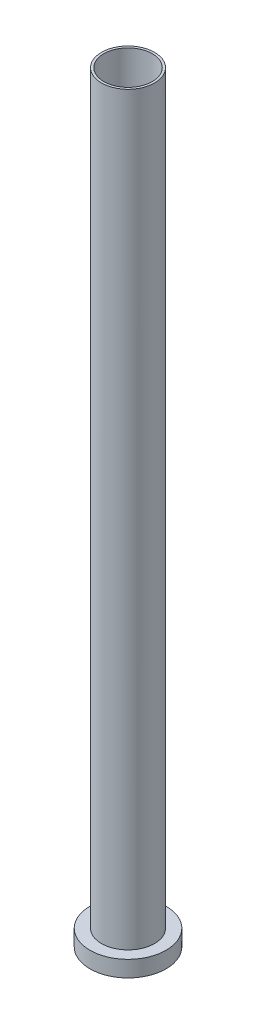
ISO-10303-21;
HEADER;
FILE_DESCRIPTION(('STEP AP214'),'2;1');
FILE_NAME('part.step','',(''),(''),'','','');
FILE_SCHEMA(('AUTOMOTIVE_DESIGN { 1 0 10303 214 1 1 1 1 }'));
ENDSEC;
DATA;
#1=APPLICATION_CONTEXT('core data for automotive mechanical design processes');
#2=APPLICATION_PROTOCOL_DEFINITION('international standard','automotive_design',2000,#1);
#3=PRODUCT_CONTEXT('',#1,'mechanical');
#4=PRODUCT('Part','Part','',(#3));
#5=PRODUCT_RELATED_PRODUCT_CATEGORY('part','',(#4));
#6=PRODUCT_DEFINITION_FORMATION('','',#4);
#7=PRODUCT_DEFINITION_CONTEXT('part definition',#1,'design');
#8=PRODUCT_DEFINITION('design','',#6,#7);
#9=PRODUCT_DEFINITION_SHAPE('','',#8);
#10=(LENGTH_UNIT() NAMED_UNIT(*) SI_UNIT(.MILLI.,.METRE.));
#11=(NAMED_UNIT(*) PLANE_ANGLE_UNIT() SI_UNIT($,.RADIAN.));
#12=(NAMED_UNIT(*) SI_UNIT($,.STERADIAN.) SOLID_ANGLE_UNIT());
#13=UNCERTAINTY_MEASURE_WITH_UNIT(LENGTH_MEASURE(1.E-05),#10,'distance_accuracy_value','');
#14=(GEOMETRIC_REPRESENTATION_CONTEXT(3) GLOBAL_UNCERTAINTY_ASSIGNED_CONTEXT((#13)) GLOBAL_UNIT_ASSIGNED_CONTEXT((#10,
#11,#12)) REPRESENTATION_CONTEXT('',''));
#15=CARTESIAN_POINT('',(0.,0.,0.));
#16=DIRECTION('',(0.,0.,1.));
#17=DIRECTION('',(1.,0.,0.));
#18=AXIS2_PLACEMENT_3D('',#15,#16,#17);
#19=CARTESIAN_POINT('',(0.,330.,0.));
#20=DIRECTION('',(0.,-1.,0.));
#21=DIRECTION('',(0.,0.,-1.));
#22=AXIS2_PLACEMENT_3D('',#19,#20,#21);
#23=CYLINDRICAL_SURFACE('',#22,11.5);
#24=CARTESIAN_POINT('',(0.,330.,0.));
#25=DIRECTION('',(0.,1.,0.));
#26=DIRECTION('',(0.,0.,1.));
#27=AXIS2_PLACEMENT_3D('',#24,#25,#26);
#28=CIRCLE('',#27,11.5);
#29=CARTESIAN_POINT('',(0.,330.,11.5));
#30=VERTEX_POINT('',#29);
#31=EDGE_CURVE('E46',#30,#30,#28,.T.);
#32=ORIENTED_EDGE('',*,*,#31,.F.);
#33=EDGE_LOOP('',(#32));
#34=FACE_BOUND('',#33,.T.);
#35=CARTESIAN_POINT('',(0.,7.00000000000001,0.));
#36=DIRECTION('',(0.,-1.,0.));
#37=DIRECTION('',(0.,0.,-1.));
#38=AXIS2_PLACEMENT_3D('',#35,#36,#37);
#39=CIRCLE('',#38,11.5);
#40=CARTESIAN_POINT('',(0.,7.00000000000001,-11.5));
#41=VERTEX_POINT('',#40);
#42=EDGE_CURVE('E10',#41,#41,#39,.T.);
#43=ORIENTED_EDGE('',*,*,#42,.F.);
#44=EDGE_LOOP('',(#43));
#45=FACE_BOUND('',#44,.T.);
#46=ADVANCED_FACE('F43',(#34,#45),#23,.T.);
#47=CARTESIAN_POINT('',(0.,330.,0.));
#48=DIRECTION('',(0.,1.,0.));
#49=DIRECTION('',(0.,0.,1.));
#50=AXIS2_PLACEMENT_3D('',#47,#48,#49);
#51=PLANE('',#50);
#52=ORIENTED_EDGE('',*,*,#31,.T.);
#53=EDGE_LOOP('',(#52));
#54=FACE_BOUND('',#53,.T.);
#55=CARTESIAN_POINT('',(0.,330.,0.));
#56=DIRECTION('',(0.,1.,0.));
#57=DIRECTION('',(0.,0.,1.));
#58=AXIS2_PLACEMENT_3D('',#55,#56,#57);
#59=CIRCLE('',#58,10.5);
#60=CARTESIAN_POINT('',(0.,330.,10.5));
#61=VERTEX_POINT('',#60);
#62=EDGE_CURVE('E57',#61,#61,#59,.T.);
#63=ORIENTED_EDGE('',*,*,#62,.F.);
#64=EDGE_LOOP('',(#63));
#65=FACE_BOUND('',#64,.T.);
#66=ADVANCED_FACE('F93',(#54,#65),#51,.T.);
#67=CARTESIAN_POINT('',(0.,0.,0.));
#68=DIRECTION('',(0.,1.,0.));
#69=DIRECTION('',(0.,0.,1.));
#70=AXIS2_PLACEMENT_3D('',#67,#68,#69);
#71=PLANE('',#70);
#72=CARTESIAN_POINT('',(0.,0.,0.));
#73=DIRECTION('',(0.,1.,0.));
#74=DIRECTION('',(0.,0.,1.));
#75=AXIS2_PLACEMENT_3D('',#72,#73,#74);
#76=CIRCLE('',#75,10.5);
#77=CARTESIAN_POINT('',(0.,0.,10.5));
#78=VERTEX_POINT('',#77);
#79=EDGE_CURVE('E64',#78,#78,#76,.T.);
#80=ORIENTED_EDGE('',*,*,#79,.T.);
#81=EDGE_LOOP('',(#80));
#82=FACE_BOUND('',#81,.T.);
#83=CARTESIAN_POINT('',(0.,0.,0.));
#84=DIRECTION('',(0.,-1.,0.));
#85=DIRECTION('',(0.,0.,-1.));
#86=AXIS2_PLACEMENT_3D('',#83,#84,#85);
#87=CIRCLE('',#86,16.5);
#88=CARTESIAN_POINT('',(0.,0.,-16.5));
#89=VERTEX_POINT('',#88);
#90=EDGE_CURVE('E56',#89,#89,#87,.T.);
#91=ORIENTED_EDGE('',*,*,#90,.T.);
#92=EDGE_LOOP('',(#91));
#93=FACE_BOUND('',#92,.T.);
#94=ADVANCED_FACE('F80',(#82,#93),#71,.F.);
#95=CARTESIAN_POINT('',(0.,330.,0.));
#96=DIRECTION('',(0.,-1.,0.));
#97=DIRECTION('',(0.,0.,-1.));
#98=AXIS2_PLACEMENT_3D('',#95,#96,#97);
#99=CYLINDRICAL_SURFACE('',#98,10.5);
#100=ORIENTED_EDGE('',*,*,#79,.F.);
#101=EDGE_LOOP('',(#100));
#102=FACE_BOUND('',#101,.T.);
#103=ORIENTED_EDGE('',*,*,#62,.T.);
#104=EDGE_LOOP('',(#103));
#105=FACE_BOUND('',#104,.T.);
#106=ADVANCED_FACE('F88',(#102,#105),#99,.F.);
#107=CARTESIAN_POINT('',(0.,7.,0.));
#108=DIRECTION('',(0.,-1.,0.));
#109=DIRECTION('',(0.,0.,-1.));
#110=AXIS2_PLACEMENT_3D('',#107,#108,#109);
#111=PLANE('',#110);
#112=CARTESIAN_POINT('',(0.,7.,0.));
#113=DIRECTION('',(0.,-1.,0.));
#114=DIRECTION('',(0.,0.,-1.));
#115=AXIS2_PLACEMENT_3D('',#112,#113,#114);
#116=CIRCLE('',#115,16.5);
#117=CARTESIAN_POINT('',(0.,7.,-16.5));
#118=VERTEX_POINT('',#117);
#119=EDGE_CURVE('E67',#118,#118,#116,.T.);
#120=ORIENTED_EDGE('',*,*,#119,.F.);
#121=EDGE_LOOP('',(#120));
#122=FACE_BOUND('',#121,.T.);
#123=ORIENTED_EDGE('',*,*,#42,.T.);
#124=EDGE_LOOP('',(#123));
#125=FACE_BOUND('',#124,.T.);
#126=ADVANCED_FACE('F82',(#122,#125),#111,.F.);
#127=CARTESIAN_POINT('',(0.,7.,0.));
#128=DIRECTION('',(0.,-1.,0.));
#129=DIRECTION('',(0.,0.,-1.));
#130=AXIS2_PLACEMENT_3D('',#127,#128,#129);
#131=CYLINDRICAL_SURFACE('',#130,16.5);
#132=ORIENTED_EDGE('',*,*,#119,.T.);
#133=EDGE_LOOP('',(#132));
#134=FACE_BOUND('',#133,.T.);
#135=ORIENTED_EDGE('',*,*,#90,.F.);
#136=EDGE_LOOP('',(#135));
#137=FACE_BOUND('',#136,.T.);
#138=ADVANCED_FACE('F76',(#134,#137),#131,.T.);
#139=CLOSED_SHELL('',(#46,#66,#94,#106,#126,#138));
#140=MANIFOLD_SOLID_BREP('B2',#139);
#141=ADVANCED_BREP_SHAPE_REPRESENTATION('',(#18,#140),#14);
#142=SHAPE_DEFINITION_REPRESENTATION(#9,#141);
ENDSEC;
END-ISO-10303-21;
